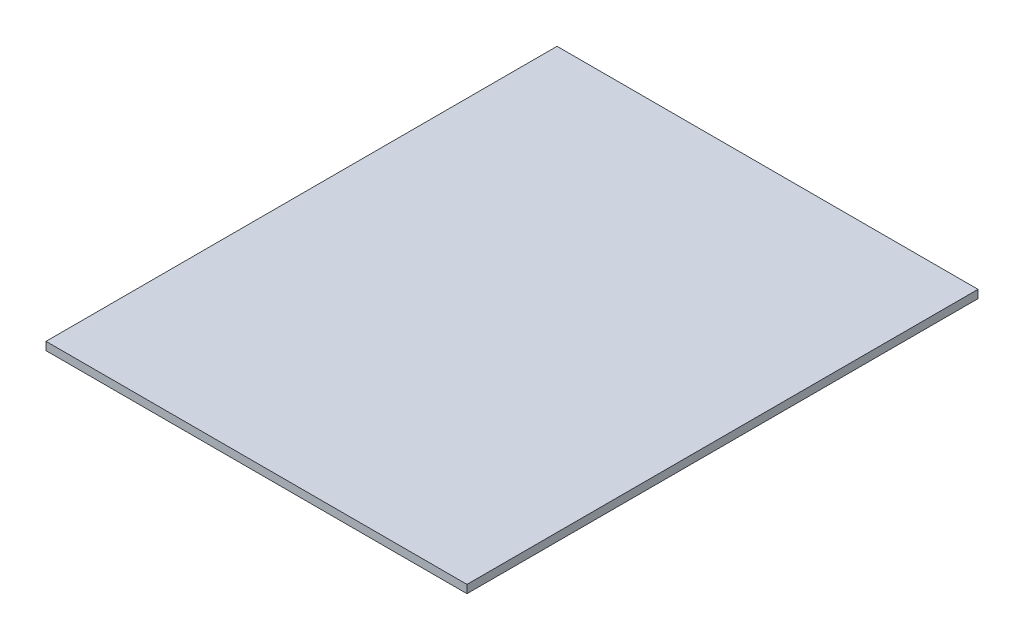
ISO-10303-21;
HEADER;
FILE_DESCRIPTION(('STEP AP214'),'2;1');
FILE_NAME('part.step','',(''),(''),'','','');
FILE_SCHEMA(('AUTOMOTIVE_DESIGN { 1 0 10303 214 1 1 1 1 }'));
ENDSEC;
DATA;
#1=APPLICATION_CONTEXT('core data for automotive mechanical design processes');
#2=APPLICATION_PROTOCOL_DEFINITION('international standard','automotive_design',2000,#1);
#3=PRODUCT_CONTEXT('',#1,'mechanical');
#4=PRODUCT('Part','Part','',(#3));
#5=PRODUCT_RELATED_PRODUCT_CATEGORY('part','',(#4));
#6=PRODUCT_DEFINITION_FORMATION('','',#4);
#7=PRODUCT_DEFINITION_CONTEXT('part definition',#1,'design');
#8=PRODUCT_DEFINITION('design','',#6,#7);
#9=PRODUCT_DEFINITION_SHAPE('','',#8);
#10=(LENGTH_UNIT() NAMED_UNIT(*) SI_UNIT(.MILLI.,.METRE.));
#11=(NAMED_UNIT(*) PLANE_ANGLE_UNIT() SI_UNIT($,.RADIAN.));
#12=(NAMED_UNIT(*) SI_UNIT($,.STERADIAN.) SOLID_ANGLE_UNIT());
#13=UNCERTAINTY_MEASURE_WITH_UNIT(LENGTH_MEASURE(1.E-05),#10,'distance_accuracy_value','');
#14=(GEOMETRIC_REPRESENTATION_CONTEXT(3) GLOBAL_UNCERTAINTY_ASSIGNED_CONTEXT((#13)) GLOBAL_UNIT_ASSIGNED_CONTEXT((#10,
#11,#12)) REPRESENTATION_CONTEXT('',''));
#15=CARTESIAN_POINT('',(0.,0.,0.));
#16=DIRECTION('',(0.,0.,1.));
#17=DIRECTION('',(1.,0.,0.));
#18=AXIS2_PLACEMENT_3D('',#15,#16,#17);
#19=CARTESIAN_POINT('',(714.,1497.,-757.5));
#20=DIRECTION('',(-1.,0.,0.));
#21=DIRECTION('',(0.,0.,1.));
#22=AXIS2_PLACEMENT_3D('',#19,#20,#21);
#23=PLANE('',#22);
#24=DIRECTION('',(0.,-1.,0.));
#25=VECTOR('',#24,1.);
#26=CARTESIAN_POINT('',(714.,1497.,0.));
#27=LINE('',#26,#25);
#28=CARTESIAN_POINT('',(714.,1509.,0.));
#29=VERTEX_POINT('',#28);
#30=CARTESIAN_POINT('',(714.,1497.,0.));
#31=VERTEX_POINT('',#30);
#32=EDGE_CURVE('E103',#29,#31,#27,.T.);
#33=ORIENTED_EDGE('',*,*,#32,.F.);
#34=DIRECTION('',(0.,0.,1.));
#35=VECTOR('',#34,1.);
#36=CARTESIAN_POINT('',(714.,1509.,-757.5));
#37=LINE('',#36,#35);
#38=CARTESIAN_POINT('',(714.,1509.,-757.5));
#39=VERTEX_POINT('',#38);
#40=EDGE_CURVE('E11',#39,#29,#37,.T.);
#41=ORIENTED_EDGE('',*,*,#40,.F.);
#42=DIRECTION('',(0.,-1.,0.));
#43=VECTOR('',#42,1.);
#44=CARTESIAN_POINT('',(714.,1497.,-757.5));
#45=LINE('',#44,#43);
#46=CARTESIAN_POINT('',(714.,1497.,-757.5));
#47=VERTEX_POINT('',#46);
#48=EDGE_CURVE('E97',#39,#47,#45,.T.);
#49=ORIENTED_EDGE('',*,*,#48,.T.);
#50=DIRECTION('',(0.,0.,1.));
#51=VECTOR('',#50,1.);
#52=CARTESIAN_POINT('',(714.,1497.,-757.5));
#53=LINE('',#52,#51);
#54=EDGE_CURVE('E42',#47,#31,#53,.T.);
#55=ORIENTED_EDGE('',*,*,#54,.T.);
#56=EDGE_LOOP('',(#33,#41,#49,#55));
#57=FACE_BOUND('',#56,.T.);
#58=ADVANCED_FACE('F39',(#57),#23,.T.);
#59=CARTESIAN_POINT('',(714.,1509.,-757.5));
#60=DIRECTION('',(0.,1.,0.));
#61=DIRECTION('',(0.,0.,1.));
#62=AXIS2_PLACEMENT_3D('',#59,#60,#61);
#63=PLANE('',#62);
#64=DIRECTION('',(-1.,0.,0.));
#65=VECTOR('',#64,1.);
#66=CARTESIAN_POINT('',(714.,1509.,0.));
#67=LINE('',#66,#65);
#68=CARTESIAN_POINT('',(1338.,1509.,0.));
#69=VERTEX_POINT('',#68);
#70=EDGE_CURVE('E99',#69,#29,#67,.T.);
#71=ORIENTED_EDGE('',*,*,#70,.F.);
#72=DIRECTION('',(0.,0.,1.));
#73=VECTOR('',#72,1.);
#74=CARTESIAN_POINT('',(1338.,1509.,-757.5));
#75=LINE('',#74,#73);
#76=CARTESIAN_POINT('',(1338.,1509.,-757.5));
#77=VERTEX_POINT('',#76);
#78=EDGE_CURVE('E48',#77,#69,#75,.T.);
#79=ORIENTED_EDGE('',*,*,#78,.F.);
#80=DIRECTION('',(-1.,0.,0.));
#81=VECTOR('',#80,1.);
#82=CARTESIAN_POINT('',(714.,1509.,-757.5));
#83=LINE('',#82,#81);
#84=EDGE_CURVE('E94',#77,#39,#83,.T.);
#85=ORIENTED_EDGE('',*,*,#84,.T.);
#86=ORIENTED_EDGE('',*,*,#40,.T.);
#87=EDGE_LOOP('',(#71,#79,#85,#86));
#88=FACE_BOUND('',#87,.T.);
#89=ADVANCED_FACE('F113',(#88),#63,.T.);
#90=CARTESIAN_POINT('',(1338.,1497.,-757.5));
#91=DIRECTION('',(1.,0.,0.));
#92=DIRECTION('',(0.,0.,-1.));
#93=AXIS2_PLACEMENT_3D('',#90,#91,#92);
#94=PLANE('',#93);
#95=DIRECTION('',(0.,1.,0.));
#96=VECTOR('',#95,1.);
#97=CARTESIAN_POINT('',(1338.,1497.,0.));
#98=LINE('',#97,#96);
#99=CARTESIAN_POINT('',(1338.,1497.,0.));
#100=VERTEX_POINT('',#99);
#101=EDGE_CURVE('E89',#100,#69,#98,.T.);
#102=ORIENTED_EDGE('',*,*,#101,.F.);
#103=DIRECTION('',(0.,0.,1.));
#104=VECTOR('',#103,1.);
#105=CARTESIAN_POINT('',(1338.,1497.,-757.5));
#106=LINE('',#105,#104);
#107=CARTESIAN_POINT('',(1338.,1497.,-757.5));
#108=VERTEX_POINT('',#107);
#109=EDGE_CURVE('E84',#108,#100,#106,.T.);
#110=ORIENTED_EDGE('',*,*,#109,.F.);
#111=DIRECTION('',(0.,1.,0.));
#112=VECTOR('',#111,1.);
#113=CARTESIAN_POINT('',(1338.,1497.,-757.5));
#114=LINE('',#113,#112);
#115=EDGE_CURVE('E87',#108,#77,#114,.T.);
#116=ORIENTED_EDGE('',*,*,#115,.T.);
#117=ORIENTED_EDGE('',*,*,#78,.T.);
#118=EDGE_LOOP('',(#102,#110,#116,#117));
#119=FACE_BOUND('',#118,.T.);
#120=ADVANCED_FACE('F86',(#119),#94,.T.);
#121=CARTESIAN_POINT('',(714.,1497.,-757.5));
#122=DIRECTION('',(0.,-1.,0.));
#123=DIRECTION('',(0.,0.,-1.));
#124=AXIS2_PLACEMENT_3D('',#121,#122,#123);
#125=PLANE('',#124);
#126=DIRECTION('',(1.,0.,0.));
#127=VECTOR('',#126,1.);
#128=CARTESIAN_POINT('',(714.,1497.,0.));
#129=LINE('',#128,#127);
#130=EDGE_CURVE('E106',#31,#100,#129,.T.);
#131=ORIENTED_EDGE('',*,*,#130,.F.);
#132=ORIENTED_EDGE('',*,*,#54,.F.);
#133=DIRECTION('',(1.,0.,0.));
#134=VECTOR('',#133,1.);
#135=CARTESIAN_POINT('',(714.,1497.,-757.5));
#136=LINE('',#135,#134);
#137=EDGE_CURVE('E93',#47,#108,#136,.T.);
#138=ORIENTED_EDGE('',*,*,#137,.T.);
#139=ORIENTED_EDGE('',*,*,#109,.T.);
#140=EDGE_LOOP('',(#131,#132,#138,#139));
#141=FACE_BOUND('',#140,.T.);
#142=ADVANCED_FACE('F96',(#141),#125,.T.);
#143=CARTESIAN_POINT('',(0.,0.,-757.5));
#144=DIRECTION('',(0.,0.,-1.));
#145=DIRECTION('',(-1.,0.,0.));
#146=AXIS2_PLACEMENT_3D('',#143,#144,#145);
#147=PLANE('',#146);
#148=ORIENTED_EDGE('',*,*,#48,.F.);
#149=ORIENTED_EDGE('',*,*,#84,.F.);
#150=ORIENTED_EDGE('',*,*,#115,.F.);
#151=ORIENTED_EDGE('',*,*,#137,.F.);
#152=EDGE_LOOP('',(#148,#149,#150,#151));
#153=FACE_BOUND('',#152,.T.);
#154=ADVANCED_FACE('F92',(#153),#147,.T.);
#155=CARTESIAN_POINT('',(0.,0.,0.));
#156=DIRECTION('',(0.,0.,-1.));
#157=DIRECTION('',(-1.,0.,0.));
#158=AXIS2_PLACEMENT_3D('',#155,#156,#157);
#159=PLANE('',#158);
#160=ORIENTED_EDGE('',*,*,#32,.T.);
#161=ORIENTED_EDGE('',*,*,#130,.T.);
#162=ORIENTED_EDGE('',*,*,#101,.T.);
#163=ORIENTED_EDGE('',*,*,#70,.T.);
#164=EDGE_LOOP('',(#160,#161,#162,#163));
#165=FACE_BOUND('',#164,.T.);
#166=ADVANCED_FACE('F112',(#165),#159,.F.);
#167=CLOSED_SHELL('',(#58,#89,#120,#142,#154,#166));
#168=MANIFOLD_SOLID_BREP('B2',#167);
#169=ADVANCED_BREP_SHAPE_REPRESENTATION('',(#18,#168),#14);
#170=SHAPE_DEFINITION_REPRESENTATION(#9,#169);
ENDSEC;
END-ISO-10303-21;
